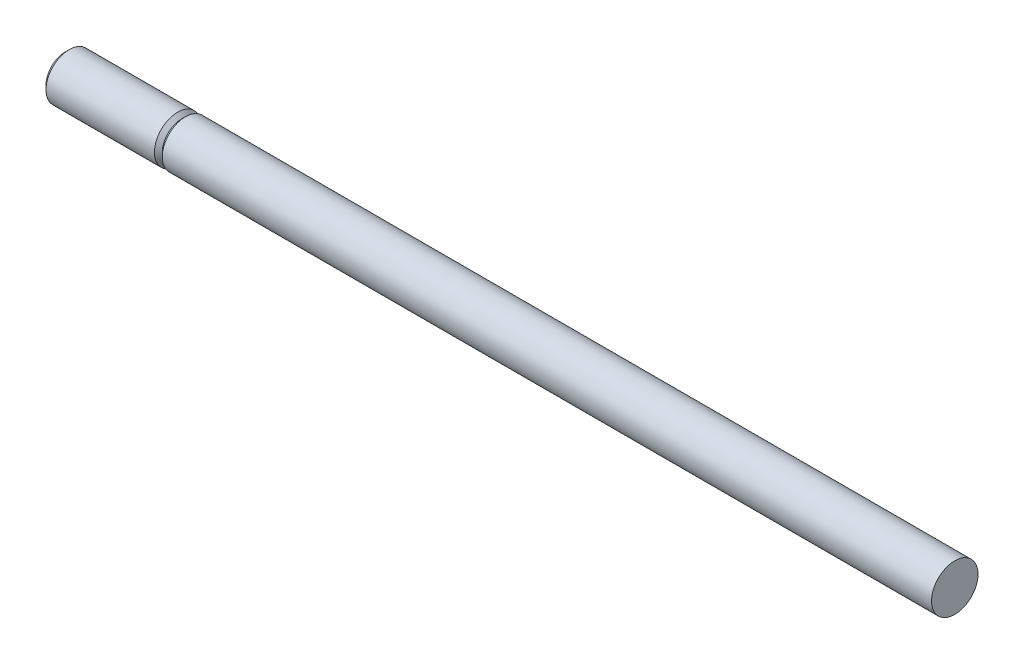
ISO-10303-21;
HEADER;
FILE_DESCRIPTION(('STEP AP214'),'2;1');
FILE_NAME('part.step','',(''),(''),'','','');
FILE_SCHEMA(('AUTOMOTIVE_DESIGN { 1 0 10303 214 1 1 1 1 }'));
ENDSEC;
DATA;
#1=APPLICATION_CONTEXT('core data for automotive mechanical design processes');
#2=APPLICATION_PROTOCOL_DEFINITION('international standard','automotive_design',2000,#1);
#3=PRODUCT_CONTEXT('',#1,'mechanical');
#4=PRODUCT('Part','Part','',(#3));
#5=PRODUCT_RELATED_PRODUCT_CATEGORY('part','',(#4));
#6=PRODUCT_DEFINITION_FORMATION('','',#4);
#7=PRODUCT_DEFINITION_CONTEXT('part definition',#1,'design');
#8=PRODUCT_DEFINITION('design','',#6,#7);
#9=PRODUCT_DEFINITION_SHAPE('','',#8);
#10=(LENGTH_UNIT() NAMED_UNIT(*) SI_UNIT(.MILLI.,.METRE.));
#11=(NAMED_UNIT(*) PLANE_ANGLE_UNIT() SI_UNIT($,.RADIAN.));
#12=(NAMED_UNIT(*) SI_UNIT($,.STERADIAN.) SOLID_ANGLE_UNIT());
#13=UNCERTAINTY_MEASURE_WITH_UNIT(LENGTH_MEASURE(1.E-05),#10,'distance_accuracy_value','');
#14=(GEOMETRIC_REPRESENTATION_CONTEXT(3) GLOBAL_UNCERTAINTY_ASSIGNED_CONTEXT((#13)) GLOBAL_UNIT_ASSIGNED_CONTEXT((#10,
#11,#12)) REPRESENTATION_CONTEXT('',''));
#15=CARTESIAN_POINT('',(0.,0.,0.));
#16=DIRECTION('',(0.,0.,1.));
#17=DIRECTION('',(1.,0.,0.));
#18=AXIS2_PLACEMENT_3D('',#15,#16,#17);
#19=CARTESIAN_POINT('',(125.,2.,0.));
#20=DIRECTION('',(1.,0.,0.));
#21=DIRECTION('',(0.,1.,0.));
#22=AXIS2_PLACEMENT_3D('',#19,#20,#21);
#23=PLANE('',#22);
#24=CARTESIAN_POINT('',(125.,0.,0.));
#25=DIRECTION('',(1.,0.,0.));
#26=DIRECTION('',(0.,1.,0.));
#27=AXIS2_PLACEMENT_3D('',#24,#25,#26);
#28=CIRCLE('',#27,4.);
#29=CARTESIAN_POINT('',(125.,4.,0.));
#30=VERTEX_POINT('',#29);
#31=EDGE_CURVE('E11',#30,#30,#28,.T.);
#32=ORIENTED_EDGE('',*,*,#31,.T.);
#33=EDGE_LOOP('',(#32));
#34=FACE_BOUND('',#33,.T.);
#35=ADVANCED_FACE('F17',(#34),#23,.T.);
#36=CARTESIAN_POINT('',(58.83828125,0.,0.));
#37=DIRECTION('',(-1.,0.,0.));
#38=DIRECTION('',(0.,1.,0.));
#39=AXIS2_PLACEMENT_3D('',#36,#37,#38);
#40=CYLINDRICAL_SURFACE('',#39,4.);
#41=CARTESIAN_POINT('',(-7.32343750000001,0.,0.));
#42=DIRECTION('',(1.,0.,0.));
#43=DIRECTION('',(0.,1.,0.));
#44=AXIS2_PLACEMENT_3D('',#41,#42,#43);
#45=CIRCLE('',#44,4.);
#46=CARTESIAN_POINT('',(-7.32343750000001,4.,0.));
#47=VERTEX_POINT('',#46);
#48=EDGE_CURVE('E24',#47,#47,#45,.T.);
#49=ORIENTED_EDGE('',*,*,#48,.T.);
#50=EDGE_LOOP('',(#49));
#51=FACE_BOUND('',#50,.T.);
#52=ORIENTED_EDGE('',*,*,#31,.F.);
#53=EDGE_LOOP('',(#52));
#54=FACE_BOUND('',#53,.T.);
#55=ADVANCED_FACE('F73',(#51,#54),#40,.T.);
#56=CARTESIAN_POINT('',(-7.66171875000003,0.,0.));
#57=DIRECTION('',(1.,0.,0.));
#58=DIRECTION('',(0.,1.,0.));
#59=AXIS2_PLACEMENT_3D('',#56,#57,#58);
#60=CONICAL_SURFACE('',#59,3.66171875,0.785398163397438);
#61=CARTESIAN_POINT('',(-8.,0.,0.));
#62=DIRECTION('',(1.,0.,0.));
#63=DIRECTION('',(0.,1.,0.));
#64=AXIS2_PLACEMENT_3D('',#61,#62,#63);
#65=CIRCLE('',#64,3.3234375);
#66=CARTESIAN_POINT('',(-8.,3.3234375,0.));
#67=VERTEX_POINT('',#66);
#68=EDGE_CURVE('E55',#67,#67,#65,.T.);
#69=ORIENTED_EDGE('',*,*,#68,.T.);
#70=EDGE_LOOP('',(#69));
#71=FACE_BOUND('',#70,.T.);
#72=ORIENTED_EDGE('',*,*,#48,.F.);
#73=EDGE_LOOP('',(#72));
#74=FACE_BOUND('',#73,.T.);
#75=ADVANCED_FACE('F58',(#71,#74),#60,.T.);
#76=CARTESIAN_POINT('',(-8.33828125000002,0.,0.));
#77=DIRECTION('',(-1.,0.,0.));
#78=DIRECTION('',(0.,1.,0.));
#79=AXIS2_PLACEMENT_3D('',#76,#77,#78);
#80=CONICAL_SURFACE('',#79,3.66171875,0.785398163397457);
#81=CARTESIAN_POINT('',(-8.67656250000002,0.,0.));
#82=DIRECTION('',(1.,0.,0.));
#83=DIRECTION('',(0.,1.,0.));
#84=AXIS2_PLACEMENT_3D('',#81,#82,#83);
#85=CIRCLE('',#84,4.);
#86=CARTESIAN_POINT('',(-8.67656250000002,4.,0.));
#87=VERTEX_POINT('',#86);
#88=EDGE_CURVE('E51',#87,#87,#85,.T.);
#89=ORIENTED_EDGE('',*,*,#88,.T.);
#90=EDGE_LOOP('',(#89));
#91=FACE_BOUND('',#90,.T.);
#92=ORIENTED_EDGE('',*,*,#68,.F.);
#93=EDGE_LOOP('',(#92));
#94=FACE_BOUND('',#93,.T.);
#95=ADVANCED_FACE('F61',(#91,#94),#80,.T.);
#96=CARTESIAN_POINT('',(-18.,0.,0.));
#97=DIRECTION('',(-1.,0.,0.));
#98=DIRECTION('',(0.,1.,0.));
#99=AXIS2_PLACEMENT_3D('',#96,#97,#98);
#100=CYLINDRICAL_SURFACE('',#99,4.);
#101=CARTESIAN_POINT('',(-27.3234375,0.,0.));
#102=DIRECTION('',(1.,0.,0.));
#103=DIRECTION('',(0.,1.,0.));
#104=AXIS2_PLACEMENT_3D('',#101,#102,#103);
#105=CIRCLE('',#104,4.);
#106=CARTESIAN_POINT('',(-27.3234375,4.,0.));
#107=VERTEX_POINT('',#106);
#108=EDGE_CURVE('E49',#107,#107,#105,.T.);
#109=ORIENTED_EDGE('',*,*,#108,.T.);
#110=EDGE_LOOP('',(#109));
#111=FACE_BOUND('',#110,.T.);
#112=ORIENTED_EDGE('',*,*,#88,.F.);
#113=EDGE_LOOP('',(#112));
#114=FACE_BOUND('',#113,.T.);
#115=ADVANCED_FACE('F63',(#111,#114),#100,.T.);
#116=CARTESIAN_POINT('',(-27.66171875,0.,0.));
#117=DIRECTION('',(1.,0.,0.));
#118=DIRECTION('',(0.,1.,0.));
#119=AXIS2_PLACEMENT_3D('',#116,#117,#118);
#120=CONICAL_SURFACE('',#119,3.66171875,0.785398163397457);
#121=CARTESIAN_POINT('',(-28.,0.,0.));
#122=DIRECTION('',(1.,0.,0.));
#123=DIRECTION('',(0.,1.,0.));
#124=AXIS2_PLACEMENT_3D('',#121,#122,#123);
#125=CIRCLE('',#124,3.3234375);
#126=CARTESIAN_POINT('',(-28.,3.3234375,0.));
#127=VERTEX_POINT('',#126);
#128=EDGE_CURVE('E45',#127,#127,#125,.T.);
#129=ORIENTED_EDGE('',*,*,#128,.T.);
#130=EDGE_LOOP('',(#129));
#131=FACE_BOUND('',#130,.T.);
#132=ORIENTED_EDGE('',*,*,#108,.F.);
#133=EDGE_LOOP('',(#132));
#134=FACE_BOUND('',#133,.T.);
#135=ADVANCED_FACE('F46',(#131,#134),#120,.T.);
#136=CARTESIAN_POINT('',(-28.,1.66171875,0.));
#137=DIRECTION('',(-1.,0.,0.));
#138=DIRECTION('',(0.,-1.,0.));
#139=AXIS2_PLACEMENT_3D('',#136,#137,#138);
#140=PLANE('',#139);
#141=ORIENTED_EDGE('',*,*,#128,.F.);
#142=EDGE_LOOP('',(#141));
#143=FACE_BOUND('',#142,.T.);
#144=ADVANCED_FACE('F110',(#143),#140,.T.);
#145=CLOSED_SHELL('',(#35,#55,#75,#95,#115,#135,#144));
#146=MANIFOLD_SOLID_BREP('B1',#145);
#147=ADVANCED_BREP_SHAPE_REPRESENTATION('',(#18,#146),#14);
#148=SHAPE_DEFINITION_REPRESENTATION(#9,#147);
ENDSEC;
END-ISO-10303-21;
